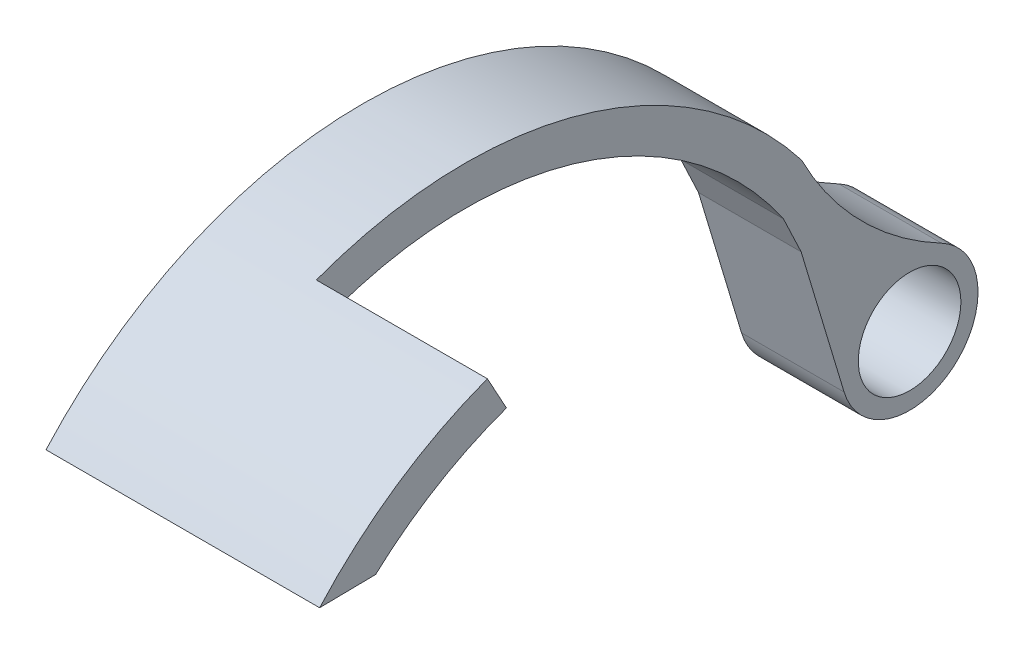
ISO-10303-21;
HEADER;
FILE_DESCRIPTION(('STEP AP214'),'2;1');
FILE_NAME('part.step','',(''),(''),'','','');
FILE_SCHEMA(('AUTOMOTIVE_DESIGN { 1 0 10303 214 1 1 1 1 }'));
ENDSEC;
DATA;
#1=APPLICATION_CONTEXT('core data for automotive mechanical design processes');
#2=APPLICATION_PROTOCOL_DEFINITION('international standard','automotive_design',2000,#1);
#3=PRODUCT_CONTEXT('',#1,'mechanical');
#4=PRODUCT('Part','Part','',(#3));
#5=PRODUCT_RELATED_PRODUCT_CATEGORY('part','',(#4));
#6=PRODUCT_DEFINITION_FORMATION('','',#4);
#7=PRODUCT_DEFINITION_CONTEXT('part definition',#1,'design');
#8=PRODUCT_DEFINITION('design','',#6,#7);
#9=PRODUCT_DEFINITION_SHAPE('','',#8);
#10=(LENGTH_UNIT() NAMED_UNIT(*) SI_UNIT(.MILLI.,.METRE.));
#11=(NAMED_UNIT(*) PLANE_ANGLE_UNIT() SI_UNIT($,.RADIAN.));
#12=(NAMED_UNIT(*) SI_UNIT($,.STERADIAN.) SOLID_ANGLE_UNIT());
#13=UNCERTAINTY_MEASURE_WITH_UNIT(LENGTH_MEASURE(1.E-05),#10,'distance_accuracy_value','');
#14=(GEOMETRIC_REPRESENTATION_CONTEXT(3) GLOBAL_UNCERTAINTY_ASSIGNED_CONTEXT((#13)) GLOBAL_UNIT_ASSIGNED_CONTEXT((#10,
#11,#12)) REPRESENTATION_CONTEXT('',''));
#15=CARTESIAN_POINT('',(0.,0.,0.));
#16=DIRECTION('',(0.,0.,1.));
#17=DIRECTION('',(1.,0.,0.));
#18=AXIS2_PLACEMENT_3D('',#15,#16,#17);
#19=CARTESIAN_POINT('',(3.,-7.262171466259,-3.2945652406581));
#20=DIRECTION('',(-1.,0.,0.));
#21=DIRECTION('',(0.,0.,1.));
#22=AXIS2_PLACEMENT_3D('',#19,#20,#21);
#23=CYLINDRICAL_SURFACE('',#22,11.2728947376073);
#24=CARTESIAN_POINT('',(0.,-7.262171466259,-3.2945652406581));
#25=DIRECTION('',(1.,0.,0.));
#26=DIRECTION('',(0.,0.,-1.));
#27=AXIS2_PLACEMENT_3D('',#24,#25,#26);
#28=CIRCLE('',#27,11.2728947376073);
#29=CARTESIAN_POINT('',(0.,-0.907670555941161,-12.6057667713921));
#30=VERTEX_POINT('',#29);
#31=CARTESIAN_POINT('',(0.,1.0504476189385,4.31979748445451));
#32=VERTEX_POINT('',#31);
#33=EDGE_CURVE('E137',#30,#32,#28,.T.);
#34=ORIENTED_EDGE('',*,*,#33,.F.);
#35=DIRECTION('',(-1.,0.,0.));
#36=VECTOR('',#35,1.);
#37=CARTESIAN_POINT('',(3.,-0.907670555941161,-12.6057667713921));
#38=LINE('',#37,#36);
#39=CARTESIAN_POINT('',(3.,-0.907670555941161,-12.6057667713921));
#40=VERTEX_POINT('',#39);
#41=EDGE_CURVE('E11',#40,#30,#38,.T.);
#42=ORIENTED_EDGE('',*,*,#41,.F.);
#43=CARTESIAN_POINT('',(3.,-7.262171466259,-3.2945652406581));
#44=DIRECTION('',(1.,0.,0.));
#45=DIRECTION('',(0.,0.,-1.));
#46=AXIS2_PLACEMENT_3D('',#43,#44,#45);
#47=CIRCLE('',#46,11.2728947376073);
#48=CARTESIAN_POINT('',(3.,3.35504723490657,0.4939467121796));
#49=VERTEX_POINT('',#48);
#50=EDGE_CURVE('E156',#40,#49,#47,.T.);
#51=ORIENTED_EDGE('',*,*,#50,.T.);
#52=DIRECTION('',(-1.,0.,0.));
#53=VECTOR('',#52,1.);
#54=CARTESIAN_POINT('',(8.,3.35504723490657,0.493946712179599));
#55=LINE('',#54,#53);
#56=CARTESIAN_POINT('',(8.,3.35504723490657,0.493946712179599));
#57=VERTEX_POINT('',#56);
#58=EDGE_CURVE('E141',#57,#49,#55,.T.);
#59=ORIENTED_EDGE('',*,*,#58,.F.);
#60=CARTESIAN_POINT('',(8.,-7.262171466259,-3.2945652406581));
#61=DIRECTION('',(-1.,0.,0.));
#62=DIRECTION('',(0.,0.,1.));
#63=AXIS2_PLACEMENT_3D('',#60,#61,#62);
#64=CIRCLE('',#63,11.2728947376073);
#65=CARTESIAN_POINT('',(8.,1.0504476189385,4.31979748445451));
#66=VERTEX_POINT('',#65);
#67=EDGE_CURVE('E190',#66,#57,#64,.T.);
#68=ORIENTED_EDGE('',*,*,#67,.F.);
#69=DIRECTION('',(-1.,0.,0.));
#70=VECTOR('',#69,1.);
#71=CARTESIAN_POINT('',(3.,1.0504476189385,4.31979748445451));
#72=LINE('',#71,#70);
#73=EDGE_CURVE('E90',#66,#32,#72,.T.);
#74=ORIENTED_EDGE('',*,*,#73,.T.);
#75=EDGE_LOOP('',(#34,#42,#51,#59,#68,#74));
#76=FACE_BOUND('',#75,.T.);
#77=ADVANCED_FACE('F37',(#76),#23,.F.);
#78=CARTESIAN_POINT('',(3.,4.70381029762597,-9.95404724804783));
#79=DIRECTION('',(0.,0.427250485793273,-0.904133299015921));
#80=DIRECTION('',(0.,0.904133299015921,0.427250485793273));
#81=AXIS2_PLACEMENT_3D('',#78,#79,#80);
#82=PLANE('',#81);
#83=DIRECTION('',(0.,-0.904133299015921,-0.427250485793273));
#84=VECTOR('',#83,1.);
#85=CARTESIAN_POINT('',(0.,4.70381029762597,-9.95404724804783));
#86=LINE('',#85,#84);
#87=CARTESIAN_POINT('',(0.,-1.9997799548143,-13.121845840392));
#88=VERTEX_POINT('',#87);
#89=EDGE_CURVE('E140',#30,#88,#86,.T.);
#90=ORIENTED_EDGE('',*,*,#89,.T.);
#91=DIRECTION('',(-1.,0.,0.));
#92=VECTOR('',#91,1.);
#93=CARTESIAN_POINT('',(3.,-1.9997799548143,-13.121845840392));
#94=LINE('',#93,#92);
#95=CARTESIAN_POINT('',(3.,-1.9997799548143,-13.121845840392));
#96=VERTEX_POINT('',#95);
#97=EDGE_CURVE('E44',#96,#88,#94,.T.);
#98=ORIENTED_EDGE('',*,*,#97,.F.);
#99=DIRECTION('',(0.,-0.904133299015921,-0.427250485793273));
#100=VECTOR('',#99,1.);
#101=CARTESIAN_POINT('',(3.,4.70381029762597,-9.95404724804783));
#102=LINE('',#101,#100);
#103=EDGE_CURVE('E111',#40,#96,#102,.T.);
#104=ORIENTED_EDGE('',*,*,#103,.F.);
#105=ORIENTED_EDGE('',*,*,#41,.T.);
#106=EDGE_LOOP('',(#90,#98,#104,#105));
#107=FACE_BOUND('',#106,.T.);
#108=ADVANCED_FACE('F220',(#107),#82,.F.);
#109=CARTESIAN_POINT('',(3.,3.45202185132422,-11.4829114005639));
#110=DIRECTION('',(0.,0.287894784783591,-0.9576620452406));
#111=DIRECTION('',(0.,0.957662045240601,0.287894784783591));
#112=AXIS2_PLACEMENT_3D('',#109,#110,#111);
#113=PLANE('',#112);
#114=DIRECTION('',(0.,-0.957662045240601,-0.287894784783591));
#115=VECTOR('',#114,1.);
#116=CARTESIAN_POINT('',(0.,3.45202185132422,-11.4829114005639));
#117=LINE('',#116,#115);
#118=CARTESIAN_POINT('',(0.,-6.17796345903512,-14.3779019268915));
#119=VERTEX_POINT('',#118);
#120=EDGE_CURVE('E120',#88,#119,#117,.T.);
#121=ORIENTED_EDGE('',*,*,#120,.T.);
#122=DIRECTION('',(-1.,0.,0.));
#123=VECTOR('',#122,1.);
#124=CARTESIAN_POINT('',(3.,-6.17796345903512,-14.3779019268915));
#125=LINE('',#124,#123);
#126=CARTESIAN_POINT('',(3.,-6.17796345903512,-14.3779019268915));
#127=VERTEX_POINT('',#126);
#128=EDGE_CURVE('E117',#127,#119,#125,.T.);
#129=ORIENTED_EDGE('',*,*,#128,.F.);
#130=DIRECTION('',(0.,-0.957662045240601,-0.287894784783591));
#131=VECTOR('',#130,1.);
#132=CARTESIAN_POINT('',(3.,3.45202185132422,-11.4829114005639));
#133=LINE('',#132,#131);
#134=EDGE_CURVE('E103',#96,#127,#133,.T.);
#135=ORIENTED_EDGE('',*,*,#134,.F.);
#136=ORIENTED_EDGE('',*,*,#97,.T.);
#137=EDGE_LOOP('',(#121,#129,#135,#136));
#138=FACE_BOUND('',#137,.T.);
#139=ADVANCED_FACE('F118',(#138),#113,.F.);
#140=CARTESIAN_POINT('',(3.,-5.60217388946794,-16.2932260173727));
#141=DIRECTION('',(-1.,0.,0.));
#142=DIRECTION('',(0.,0.,1.));
#143=AXIS2_PLACEMENT_3D('',#140,#141,#142);
#144=CYLINDRICAL_SURFACE('',#143,2.);
#145=CARTESIAN_POINT('',(0.,-5.60217388946794,-16.2932260173727));
#146=DIRECTION('',(1.,0.,0.));
#147=DIRECTION('',(0.,0.,-1.));
#148=AXIS2_PLACEMENT_3D('',#145,#146,#147);
#149=CIRCLE('',#148,2.);
#150=CARTESIAN_POINT('',(0.,-3.8338654304691,-17.2276162965565));
#151=VERTEX_POINT('',#150);
#152=EDGE_CURVE('E144',#119,#151,#149,.T.);
#153=ORIENTED_EDGE('',*,*,#152,.T.);
#154=DIRECTION('',(-1.,0.,0.));
#155=VECTOR('',#154,1.);
#156=CARTESIAN_POINT('',(3.,-3.8338654304691,-17.2276162965565));
#157=LINE('',#156,#155);
#158=CARTESIAN_POINT('',(3.,-3.8338654304691,-17.2276162965565));
#159=VERTEX_POINT('',#158);
#160=EDGE_CURVE('E124',#159,#151,#157,.T.);
#161=ORIENTED_EDGE('',*,*,#160,.F.);
#162=CARTESIAN_POINT('',(3.,-5.60217388946794,-16.2932260173727));
#163=DIRECTION('',(1.,0.,0.));
#164=DIRECTION('',(0.,0.,-1.));
#165=AXIS2_PLACEMENT_3D('',#162,#163,#164);
#166=CIRCLE('',#165,2.);
#167=EDGE_CURVE('E109',#127,#159,#166,.T.);
#168=ORIENTED_EDGE('',*,*,#167,.F.);
#169=ORIENTED_EDGE('',*,*,#128,.T.);
#170=EDGE_LOOP('',(#153,#161,#168,#169));
#171=FACE_BOUND('',#170,.T.);
#172=ADVANCED_FACE('F126',(#171),#144,.T.);
#173=CARTESIAN_POINT('',(3.,4.71352462951417,-21.7441349750694));
#174=DIRECTION('',(-1.,0.,0.));
#175=DIRECTION('',(0.,0.,1.));
#176=AXIS2_PLACEMENT_3D('',#173,#174,#175);
#177=CYLINDRICAL_SURFACE('',#176,9.66730664719273);
#178=CARTESIAN_POINT('',(0.,4.71352462951417,-21.7441349750694));
#179=DIRECTION('',(1.,0.,0.));
#180=DIRECTION('',(0.,0.,-1.));
#181=AXIS2_PLACEMENT_3D('',#178,#179,#180);
#182=CIRCLE('',#181,9.66730664719273);
#183=CARTESIAN_POINT('',(0.,0.320027847745726,-13.1328630690472));
#184=VERTEX_POINT('',#183);
#185=EDGE_CURVE('E146',#184,#151,#182,.T.);
#186=ORIENTED_EDGE('',*,*,#185,.F.);
#187=DIRECTION('',(-1.,0.,0.));
#188=VECTOR('',#187,1.);
#189=CARTESIAN_POINT('',(3.,0.320027847745726,-13.1328630690472));
#190=LINE('',#189,#188);
#191=CARTESIAN_POINT('',(3.,0.320027847745726,-13.1328630690472));
#192=VERTEX_POINT('',#191);
#193=EDGE_CURVE('E60',#192,#184,#190,.T.);
#194=ORIENTED_EDGE('',*,*,#193,.F.);
#195=CARTESIAN_POINT('',(3.,4.71352462951417,-21.7441349750694));
#196=DIRECTION('',(1.,0.,0.));
#197=DIRECTION('',(0.,0.,-1.));
#198=AXIS2_PLACEMENT_3D('',#195,#196,#197);
#199=CIRCLE('',#198,9.66730664719273);
#200=EDGE_CURVE('E127',#192,#159,#199,.T.);
#201=ORIENTED_EDGE('',*,*,#200,.T.);
#202=ORIENTED_EDGE('',*,*,#160,.T.);
#203=EDGE_LOOP('',(#186,#194,#201,#202));
#204=FACE_BOUND('',#203,.T.);
#205=ADVANCED_FACE('F169',(#204),#177,.F.);
#206=CARTESIAN_POINT('',(3.,-7.262171466259,-3.2945652406581));
#207=DIRECTION('',(-1.,0.,0.));
#208=DIRECTION('',(0.,0.,1.));
#209=AXIS2_PLACEMENT_3D('',#206,#207,#208);
#210=CYLINDRICAL_SURFACE('',#209,12.4210245389573);
#211=CARTESIAN_POINT('',(0.,-7.262171466259,-3.2945652406581));
#212=DIRECTION('',(1.,0.,0.));
#213=DIRECTION('',(0.,0.,-1.));
#214=AXIS2_PLACEMENT_3D('',#211,#212,#213);
#215=CIRCLE('',#214,12.4210245389573);
#216=CARTESIAN_POINT('',(0.,1.02687417666664,5.95603327656635));
#217=VERTEX_POINT('',#216);
#218=EDGE_CURVE('E149',#184,#217,#215,.T.);
#219=ORIENTED_EDGE('',*,*,#218,.T.);
#220=DIRECTION('',(-1.,0.,0.));
#221=VECTOR('',#220,1.);
#222=CARTESIAN_POINT('',(3.,1.02687417666664,5.95603327656635));
#223=LINE('',#222,#221);
#224=CARTESIAN_POINT('',(8.,1.02687417666664,5.95603327656635));
#225=VERTEX_POINT('',#224);
#226=EDGE_CURVE('E158',#225,#217,#223,.T.);
#227=ORIENTED_EDGE('',*,*,#226,.F.);
#228=CARTESIAN_POINT('',(8.,-7.262171466259,-3.2945652406581));
#229=DIRECTION('',(1.,0.,0.));
#230=DIRECTION('',(0.,0.,1.));
#231=AXIS2_PLACEMENT_3D('',#228,#229,#230);
#232=CIRCLE('',#231,12.4210245389573);
#233=CARTESIAN_POINT('',(8.,4.37374771006016,1.05137948052137));
#234=VERTEX_POINT('',#233);
#235=EDGE_CURVE('E181',#234,#225,#232,.T.);
#236=ORIENTED_EDGE('',*,*,#235,.F.);
#237=DIRECTION('',(-1.,0.,0.));
#238=VECTOR('',#237,1.);
#239=CARTESIAN_POINT('',(8.,4.37374771006016,1.05137948052137));
#240=LINE('',#239,#238);
#241=CARTESIAN_POINT('',(3.,4.37374771006016,1.05137948052137));
#242=VERTEX_POINT('',#241);
#243=EDGE_CURVE('E178',#234,#242,#240,.T.);
#244=ORIENTED_EDGE('',*,*,#243,.T.);
#245=CARTESIAN_POINT('',(3.,-7.262171466259,-3.2945652406581));
#246=DIRECTION('',(1.,0.,0.));
#247=DIRECTION('',(0.,0.,-1.));
#248=AXIS2_PLACEMENT_3D('',#245,#246,#247);
#249=CIRCLE('',#248,12.4210245389573);
#250=EDGE_CURVE('E129',#192,#242,#249,.T.);
#251=ORIENTED_EDGE('',*,*,#250,.F.);
#252=ORIENTED_EDGE('',*,*,#193,.T.);
#253=EDGE_LOOP('',(#219,#227,#236,#244,#251,#252));
#254=FACE_BOUND('',#253,.T.);
#255=ADVANCED_FACE('F183',(#254),#210,.T.);
#256=CARTESIAN_POINT('',(3.,1.11245254513047,0.0160272351816498));
#257=DIRECTION('',(0.,0.999896233627667,0.0144056231106173));
#258=DIRECTION('',(0.,-0.0144056231106173,0.999896233627668));
#259=AXIS2_PLACEMENT_3D('',#256,#257,#258);
#260=PLANE('',#259);
#261=DIRECTION('',(0.,0.0144056231106173,-0.999896233627667));
#262=VECTOR('',#261,1.);
#263=CARTESIAN_POINT('',(0.,1.11245254513047,0.0160272351816498));
#264=LINE('',#263,#262);
#265=EDGE_CURVE('E151',#217,#32,#264,.T.);
#266=ORIENTED_EDGE('',*,*,#265,.T.);
#267=ORIENTED_EDGE('',*,*,#73,.F.);
#268=DIRECTION('',(0.,0.0144056231106171,-0.999896233627668));
#269=VECTOR('',#268,1.);
#270=CARTESIAN_POINT('',(8.,1.02687417666664,5.95603327656635));
#271=LINE('',#270,#269);
#272=EDGE_CURVE('E204',#225,#66,#271,.T.);
#273=ORIENTED_EDGE('',*,*,#272,.F.);
#274=ORIENTED_EDGE('',*,*,#226,.T.);
#275=EDGE_LOOP('',(#266,#267,#273,#274));
#276=FACE_BOUND('',#275,.T.);
#277=ADVANCED_FACE('F205',(#276),#260,.F.);
#278=CARTESIAN_POINT('',(3.,-5.60217388946794,-16.2932260173727));
#279=DIRECTION('',(-1.,0.,0.));
#280=DIRECTION('',(0.,0.,1.));
#281=AXIS2_PLACEMENT_3D('',#278,#279,#280);
#282=CYLINDRICAL_SURFACE('',#281,1.5);
#283=CARTESIAN_POINT('',(3.,-5.60217388946794,-16.2932260173727));
#284=DIRECTION('',(1.,0.,0.));
#285=DIRECTION('',(0.,0.,-1.));
#286=AXIS2_PLACEMENT_3D('',#283,#284,#285);
#287=CIRCLE('',#286,1.5);
#288=CARTESIAN_POINT('',(3.,-5.60217388946794,-17.7932260173727));
#289=VERTEX_POINT('',#288);
#290=EDGE_CURVE('E134',#289,#289,#287,.T.);
#291=ORIENTED_EDGE('',*,*,#290,.T.);
#292=EDGE_LOOP('',(#291));
#293=FACE_BOUND('',#292,.T.);
#294=CARTESIAN_POINT('',(0.,-5.60217388946794,-16.2932260173727));
#295=DIRECTION('',(1.,0.,0.));
#296=DIRECTION('',(0.,0.,-1.));
#297=AXIS2_PLACEMENT_3D('',#294,#295,#296);
#298=CIRCLE('',#297,1.5);
#299=CARTESIAN_POINT('',(0.,-5.60217388946794,-17.7932260173727));
#300=VERTEX_POINT('',#299);
#301=EDGE_CURVE('E153',#300,#300,#298,.T.);
#302=ORIENTED_EDGE('',*,*,#301,.F.);
#303=EDGE_LOOP('',(#302));
#304=FACE_BOUND('',#303,.T.);
#305=ADVANCED_FACE('F210',(#293,#304),#282,.F.);
#306=CARTESIAN_POINT('',(3.,0.,0.));
#307=DIRECTION('',(1.,0.,0.));
#308=DIRECTION('',(0.,0.,-1.));
#309=AXIS2_PLACEMENT_3D('',#306,#307,#308);
#310=PLANE('',#309);
#311=DIRECTION('',(0.,0.877251137523018,0.480031709071985));
#312=VECTOR('',#311,1.);
#313=CARTESIAN_POINT('',(3.,3.35504723490657,0.493946712179599));
#314=LINE('',#313,#312);
#315=EDGE_CURVE('E51',#49,#242,#314,.T.);
#316=ORIENTED_EDGE('',*,*,#315,.F.);
#317=ORIENTED_EDGE('',*,*,#50,.F.);
#318=ORIENTED_EDGE('',*,*,#103,.T.);
#319=ORIENTED_EDGE('',*,*,#134,.T.);
#320=ORIENTED_EDGE('',*,*,#167,.T.);
#321=ORIENTED_EDGE('',*,*,#200,.F.);
#322=ORIENTED_EDGE('',*,*,#250,.T.);
#323=EDGE_LOOP('',(#316,#317,#318,#319,#320,#321,#322));
#324=FACE_BOUND('',#323,.T.);
#325=ORIENTED_EDGE('',*,*,#290,.F.);
#326=EDGE_LOOP('',(#325));
#327=FACE_BOUND('',#326,.T.);
#328=ADVANCED_FACE('F105',(#324,#327),#310,.T.);
#329=CARTESIAN_POINT('',(0.,0.,0.));
#330=DIRECTION('',(1.,0.,0.));
#331=DIRECTION('',(0.,0.,-1.));
#332=AXIS2_PLACEMENT_3D('',#329,#330,#331);
#333=PLANE('',#332);
#334=ORIENTED_EDGE('',*,*,#33,.T.);
#335=ORIENTED_EDGE('',*,*,#265,.F.);
#336=ORIENTED_EDGE('',*,*,#218,.F.);
#337=ORIENTED_EDGE('',*,*,#185,.T.);
#338=ORIENTED_EDGE('',*,*,#152,.F.);
#339=ORIENTED_EDGE('',*,*,#120,.F.);
#340=ORIENTED_EDGE('',*,*,#89,.F.);
#341=EDGE_LOOP('',(#334,#335,#336,#337,#338,#339,#340));
#342=FACE_BOUND('',#341,.T.);
#343=ORIENTED_EDGE('',*,*,#301,.T.);
#344=EDGE_LOOP('',(#343));
#345=FACE_BOUND('',#344,.T.);
#346=ADVANCED_FACE('F165',(#342,#345),#333,.F.);
#347=CARTESIAN_POINT('',(8.,3.35504723490657,0.493946712179599));
#348=DIRECTION('',(0.,-0.480031709071985,0.877251137523018));
#349=DIRECTION('',(0.,-0.877251137523018,-0.480031709071985));
#350=AXIS2_PLACEMENT_3D('',#347,#348,#349);
#351=PLANE('',#350);
#352=ORIENTED_EDGE('',*,*,#315,.T.);
#353=ORIENTED_EDGE('',*,*,#243,.F.);
#354=DIRECTION('',(0.,0.877251137523018,0.480031709071985));
#355=VECTOR('',#354,1.);
#356=CARTESIAN_POINT('',(8.,3.35504723490657,0.493946712179599));
#357=LINE('',#356,#355);
#358=EDGE_CURVE('E186',#57,#234,#357,.T.);
#359=ORIENTED_EDGE('',*,*,#358,.F.);
#360=ORIENTED_EDGE('',*,*,#58,.T.);
#361=EDGE_LOOP('',(#352,#353,#359,#360));
#362=FACE_BOUND('',#361,.T.);
#363=ADVANCED_FACE('F176',(#362),#351,.F.);
#364=CARTESIAN_POINT('',(8.,-7.262171466259,-3.2945652406581));
#365=DIRECTION('',(-1.,0.,0.));
#366=DIRECTION('',(0.,0.,1.));
#367=AXIS2_PLACEMENT_3D('',#364,#365,#366);
#368=PLANE('',#367);
#369=ORIENTED_EDGE('',*,*,#235,.T.);
#370=ORIENTED_EDGE('',*,*,#272,.T.);
#371=ORIENTED_EDGE('',*,*,#67,.T.);
#372=ORIENTED_EDGE('',*,*,#358,.T.);
#373=EDGE_LOOP('',(#369,#370,#371,#372));
#374=FACE_BOUND('',#373,.T.);
#375=ADVANCED_FACE('F198',(#374),#368,.F.);
#376=CLOSED_SHELL('',(#77,#108,#139,#172,#205,#255,#277,#305,#328,#346,#363,#375));
#377=MANIFOLD_SOLID_BREP('B2',#376);
#378=ADVANCED_BREP_SHAPE_REPRESENTATION('',(#18,#377),#14);
#379=SHAPE_DEFINITION_REPRESENTATION(#9,#378);
ENDSEC;
END-ISO-10303-21;
